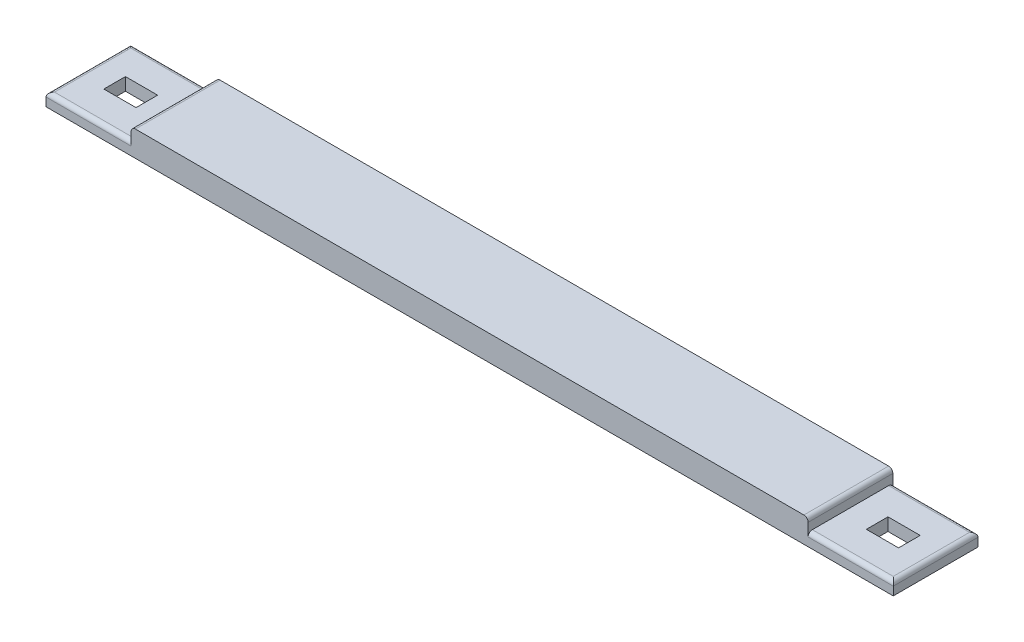
ISO-10303-21;
HEADER;
FILE_DESCRIPTION(('STEP AP214'),'2;1');
FILE_NAME('part.step','',(''),(''),'','','');
FILE_SCHEMA(('AUTOMOTIVE_DESIGN { 1 0 10303 214 1 1 1 1 }'));
ENDSEC;
DATA;
#1=APPLICATION_CONTEXT('core data for automotive mechanical design processes');
#2=APPLICATION_PROTOCOL_DEFINITION('international standard','automotive_design',2000,#1);
#3=PRODUCT_CONTEXT('',#1,'mechanical');
#4=PRODUCT('Part','Part','',(#3));
#5=PRODUCT_RELATED_PRODUCT_CATEGORY('part','',(#4));
#6=PRODUCT_DEFINITION_FORMATION('','',#4);
#7=PRODUCT_DEFINITION_CONTEXT('part definition',#1,'design');
#8=PRODUCT_DEFINITION('design','',#6,#7);
#9=PRODUCT_DEFINITION_SHAPE('','',#8);
#10=(LENGTH_UNIT() NAMED_UNIT(*) SI_UNIT(.MILLI.,.METRE.));
#11=(NAMED_UNIT(*) PLANE_ANGLE_UNIT() SI_UNIT($,.RADIAN.));
#12=(NAMED_UNIT(*) SI_UNIT($,.STERADIAN.) SOLID_ANGLE_UNIT());
#13=UNCERTAINTY_MEASURE_WITH_UNIT(LENGTH_MEASURE(1.E-05),#10,'distance_accuracy_value','');
#14=(GEOMETRIC_REPRESENTATION_CONTEXT(3) GLOBAL_UNCERTAINTY_ASSIGNED_CONTEXT((#13)) GLOBAL_UNIT_ASSIGNED_CONTEXT((#10,
#11,#12)) REPRESENTATION_CONTEXT('',''));
#15=CARTESIAN_POINT('',(0.,0.,0.));
#16=DIRECTION('',(0.,0.,1.));
#17=DIRECTION('',(1.,0.,0.));
#18=AXIS2_PLACEMENT_3D('',#15,#16,#17);
#19=CARTESIAN_POINT('',(-100.,6.,9.99999999999999));
#20=DIRECTION('',(1.,0.,0.));
#21=DIRECTION('',(0.,0.,-1.));
#22=AXIS2_PLACEMENT_3D('',#19,#20,#21);
#23=PLANE('',#22);
#24=DIRECTION('',(0.,-1.,0.));
#25=VECTOR('',#24,1.);
#26=CARTESIAN_POINT('',(-100.,6.,9.99999999999999));
#27=LINE('',#26,#25);
#28=CARTESIAN_POINT('',(-100.,2.,9.99999999999999));
#29=VERTEX_POINT('',#28);
#30=CARTESIAN_POINT('',(-100.,0.,9.99999999999999));
#31=VERTEX_POINT('',#30);
#32=EDGE_CURVE('E287',#29,#31,#27,.T.);
#33=ORIENTED_EDGE('',*,*,#32,.F.);
#34=DIRECTION('',(0.,0.,1.));
#35=VECTOR('',#34,1.);
#36=CARTESIAN_POINT('',(-100.,2.,-10.));
#37=LINE('',#36,#35);
#38=CARTESIAN_POINT('',(-100.,2.,-10.));
#39=VERTEX_POINT('',#38);
#40=EDGE_CURVE('E348',#29,#39,#37,.F.);
#41=ORIENTED_EDGE('',*,*,#40,.T.);
#42=DIRECTION('',(0.,-1.,0.));
#43=VECTOR('',#42,1.);
#44=CARTESIAN_POINT('',(-100.,6.,-10.));
#45=LINE('',#44,#43);
#46=CARTESIAN_POINT('',(-100.,0.,-10.));
#47=VERTEX_POINT('',#46);
#48=EDGE_CURVE('E290',#39,#47,#45,.T.);
#49=ORIENTED_EDGE('',*,*,#48,.T.);
#50=DIRECTION('',(0.,0.,1.));
#51=VECTOR('',#50,1.);
#52=CARTESIAN_POINT('',(-100.,0.,9.99999999999999));
#53=LINE('',#52,#51);
#54=EDGE_CURVE('E278',#47,#31,#53,.T.);
#55=ORIENTED_EDGE('',*,*,#54,.T.);
#56=EDGE_LOOP('',(#33,#41,#49,#55));
#57=FACE_BOUND('',#56,.T.);
#58=ADVANCED_FACE('F38',(#57),#23,.F.);
#59=CARTESIAN_POINT('',(-86.2,6.,2.54999999999998));
#60=DIRECTION('',(-1.,0.,0.));
#61=DIRECTION('',(0.,0.,1.));
#62=AXIS2_PLACEMENT_3D('',#59,#60,#61);
#63=PLANE('',#62);
#64=DIRECTION('',(0.,-1.,0.));
#65=VECTOR('',#64,1.);
#66=CARTESIAN_POINT('',(-86.2,6.,2.54999999999998));
#67=LINE('',#66,#65);
#68=CARTESIAN_POINT('',(-86.2,3.,2.54999999999998));
#69=VERTEX_POINT('',#68);
#70=CARTESIAN_POINT('',(-86.2,0.,2.54999999999998));
#71=VERTEX_POINT('',#70);
#72=EDGE_CURVE('E248',#69,#71,#67,.T.);
#73=ORIENTED_EDGE('',*,*,#72,.F.);
#74=DIRECTION('',(0.,0.,-1.));
#75=VECTOR('',#74,1.);
#76=CARTESIAN_POINT('',(-86.2,3.,2.54999999999998));
#77=LINE('',#76,#75);
#78=CARTESIAN_POINT('',(-86.2,3.,-2.55000000000002));
#79=VERTEX_POINT('',#78);
#80=EDGE_CURVE('E421',#69,#79,#77,.T.);
#81=ORIENTED_EDGE('',*,*,#80,.T.);
#82=DIRECTION('',(0.,-1.,0.));
#83=VECTOR('',#82,1.);
#84=CARTESIAN_POINT('',(-86.2,6.,-2.55000000000002));
#85=LINE('',#84,#83);
#86=CARTESIAN_POINT('',(-86.2,0.,-2.55000000000002));
#87=VERTEX_POINT('',#86);
#88=EDGE_CURVE('E257',#79,#87,#85,.T.);
#89=ORIENTED_EDGE('',*,*,#88,.T.);
#90=DIRECTION('',(0.,0.,-1.));
#91=VECTOR('',#90,1.);
#92=CARTESIAN_POINT('',(-86.2,0.,2.54999999999998));
#93=LINE('',#92,#91);
#94=EDGE_CURVE('E232',#71,#87,#93,.T.);
#95=ORIENTED_EDGE('',*,*,#94,.F.);
#96=EDGE_LOOP('',(#73,#81,#89,#95));
#97=FACE_BOUND('',#96,.T.);
#98=ADVANCED_FACE('F459',(#97),#63,.T.);
#99=CARTESIAN_POINT('',(-93.8,6.,-2.55000000000002));
#100=DIRECTION('',(0.,0.,1.));
#101=DIRECTION('',(1.,0.,0.));
#102=AXIS2_PLACEMENT_3D('',#99,#100,#101);
#103=PLANE('',#102);
#104=ORIENTED_EDGE('',*,*,#88,.F.);
#105=DIRECTION('',(-1.,0.,0.));
#106=VECTOR('',#105,1.);
#107=CARTESIAN_POINT('',(-93.8,3.,-2.55000000000002));
#108=LINE('',#107,#106);
#109=CARTESIAN_POINT('',(-93.8,3.,-2.55000000000002));
#110=VERTEX_POINT('',#109);
#111=EDGE_CURVE('E417',#79,#110,#108,.T.);
#112=ORIENTED_EDGE('',*,*,#111,.T.);
#113=DIRECTION('',(0.,-1.,0.));
#114=VECTOR('',#113,1.);
#115=CARTESIAN_POINT('',(-93.8,6.,-2.55000000000002));
#116=LINE('',#115,#114);
#117=CARTESIAN_POINT('',(-93.8,0.,-2.55000000000002));
#118=VERTEX_POINT('',#117);
#119=EDGE_CURVE('E254',#110,#118,#116,.T.);
#120=ORIENTED_EDGE('',*,*,#119,.T.);
#121=DIRECTION('',(-1.,0.,0.));
#122=VECTOR('',#121,1.);
#123=CARTESIAN_POINT('',(-93.8,0.,-2.55000000000002));
#124=LINE('',#123,#122);
#125=EDGE_CURVE('E236',#87,#118,#124,.T.);
#126=ORIENTED_EDGE('',*,*,#125,.F.);
#127=EDGE_LOOP('',(#104,#112,#120,#126));
#128=FACE_BOUND('',#127,.T.);
#129=ADVANCED_FACE('F467',(#128),#103,.T.);
#130=CARTESIAN_POINT('',(-93.8,6.,2.54999999999998));
#131=DIRECTION('',(1.,0.,0.));
#132=DIRECTION('',(0.,0.,-1.));
#133=AXIS2_PLACEMENT_3D('',#130,#131,#132);
#134=PLANE('',#133);
#135=ORIENTED_EDGE('',*,*,#119,.F.);
#136=DIRECTION('',(0.,0.,1.));
#137=VECTOR('',#136,1.);
#138=CARTESIAN_POINT('',(-93.8,3.,2.54999999999998));
#139=LINE('',#138,#137);
#140=CARTESIAN_POINT('',(-93.8,3.,2.54999999999998));
#141=VERTEX_POINT('',#140);
#142=EDGE_CURVE('E413',#110,#141,#139,.T.);
#143=ORIENTED_EDGE('',*,*,#142,.T.);
#144=DIRECTION('',(0.,-1.,0.));
#145=VECTOR('',#144,1.);
#146=CARTESIAN_POINT('',(-93.8,6.,2.54999999999998));
#147=LINE('',#146,#145);
#148=CARTESIAN_POINT('',(-93.8,0.,2.54999999999998));
#149=VERTEX_POINT('',#148);
#150=EDGE_CURVE('E251',#141,#149,#147,.T.);
#151=ORIENTED_EDGE('',*,*,#150,.T.);
#152=DIRECTION('',(0.,0.,1.));
#153=VECTOR('',#152,1.);
#154=CARTESIAN_POINT('',(-93.8,0.,2.54999999999998));
#155=LINE('',#154,#153);
#156=EDGE_CURVE('E240',#118,#149,#155,.T.);
#157=ORIENTED_EDGE('',*,*,#156,.F.);
#158=EDGE_LOOP('',(#135,#143,#151,#157));
#159=FACE_BOUND('',#158,.T.);
#160=ADVANCED_FACE('F596',(#159),#134,.T.);
#161=CARTESIAN_POINT('',(-93.8,6.,2.54999999999998));
#162=DIRECTION('',(0.,0.,-1.));
#163=DIRECTION('',(-1.,0.,0.));
#164=AXIS2_PLACEMENT_3D('',#161,#162,#163);
#165=PLANE('',#164);
#166=ORIENTED_EDGE('',*,*,#150,.F.);
#167=DIRECTION('',(1.,0.,0.));
#168=VECTOR('',#167,1.);
#169=CARTESIAN_POINT('',(-93.8,3.,2.54999999999998));
#170=LINE('',#169,#168);
#171=EDGE_CURVE('E202',#141,#69,#170,.T.);
#172=ORIENTED_EDGE('',*,*,#171,.T.);
#173=ORIENTED_EDGE('',*,*,#72,.T.);
#174=DIRECTION('',(1.,0.,0.));
#175=VECTOR('',#174,1.);
#176=CARTESIAN_POINT('',(-93.8,0.,2.54999999999998));
#177=LINE('',#176,#175);
#178=EDGE_CURVE('E244',#149,#71,#177,.T.);
#179=ORIENTED_EDGE('',*,*,#178,.F.);
#180=EDGE_LOOP('',(#166,#172,#173,#179));
#181=FACE_BOUND('',#180,.T.);
#182=ADVANCED_FACE('F590',(#181),#165,.T.);
#183=CARTESIAN_POINT('',(0.,6.,0.));
#184=DIRECTION('',(0.,-1.,0.));
#185=DIRECTION('',(0.,0.,-1.));
#186=AXIS2_PLACEMENT_3D('',#183,#184,#185);
#187=PLANE('',#186);
#188=DIRECTION('',(1.,0.,0.));
#189=VECTOR('',#188,1.);
#190=CARTESIAN_POINT('',(-100.,6.,9.99999999999999));
#191=LINE('',#190,#189);
#192=CARTESIAN_POINT('',(-78.9000000000001,6.,9.99999999999999));
#193=VERTEX_POINT('',#192);
#194=CARTESIAN_POINT('',(78.8999999999999,6.,9.99999999999999));
#195=VERTEX_POINT('',#194);
#196=EDGE_CURVE('E265',#193,#195,#191,.T.);
#197=ORIENTED_EDGE('',*,*,#196,.T.);
#198=DIRECTION('',(0.,0.,1.));
#199=VECTOR('',#198,1.);
#200=CARTESIAN_POINT('',(78.8999999999999,6.,0.));
#201=LINE('',#200,#199);
#202=CARTESIAN_POINT('',(78.8999999999999,6.,-10.));
#203=VERTEX_POINT('',#202);
#204=EDGE_CURVE('E318',#195,#203,#201,.F.);
#205=ORIENTED_EDGE('',*,*,#204,.T.);
#206=DIRECTION('',(-1.,0.,0.));
#207=VECTOR('',#206,1.);
#208=CARTESIAN_POINT('',(-100.,6.,-10.));
#209=LINE('',#208,#207);
#210=CARTESIAN_POINT('',(-78.9000000000001,6.,-10.));
#211=VERTEX_POINT('',#210);
#212=EDGE_CURVE('E261',#203,#211,#209,.T.);
#213=ORIENTED_EDGE('',*,*,#212,.T.);
#214=DIRECTION('',(0.,0.,-1.));
#215=VECTOR('',#214,1.);
#216=CARTESIAN_POINT('',(-78.9000000000001,6.,0.));
#217=LINE('',#216,#215);
#218=EDGE_CURVE('E315',#211,#193,#217,.F.);
#219=ORIENTED_EDGE('',*,*,#218,.T.);
#220=EDGE_LOOP('',(#197,#205,#213,#219));
#221=FACE_BOUND('',#220,.T.);
#222=ADVANCED_FACE('F595',(#221),#187,.F.);
#223=CARTESIAN_POINT('',(0.,0.,0.));
#224=DIRECTION('',(0.,-1.,0.));
#225=DIRECTION('',(0.,0.,-1.));
#226=AXIS2_PLACEMENT_3D('',#223,#224,#225);
#227=PLANE('',#226);
#228=DIRECTION('',(0.,0.,-1.));
#229=VECTOR('',#228,1.);
#230=CARTESIAN_POINT('',(99.9999999999999,0.,9.99999999999999));
#231=LINE('',#230,#229);
#232=CARTESIAN_POINT('',(99.9999999999999,0.,9.99999999999999));
#233=VERTEX_POINT('',#232);
#234=CARTESIAN_POINT('',(99.9999999999999,0.,-10.));
#235=VERTEX_POINT('',#234);
#236=EDGE_CURVE('E260',#233,#235,#231,.T.);
#237=ORIENTED_EDGE('',*,*,#236,.F.);
#238=DIRECTION('',(1.,0.,0.));
#239=VECTOR('',#238,1.);
#240=CARTESIAN_POINT('',(-100.,0.,9.99999999999999));
#241=LINE('',#240,#239);
#242=EDGE_CURVE('E266',#31,#233,#241,.T.);
#243=ORIENTED_EDGE('',*,*,#242,.F.);
#244=ORIENTED_EDGE('',*,*,#54,.F.);
#245=DIRECTION('',(-1.,0.,0.));
#246=VECTOR('',#245,1.);
#247=CARTESIAN_POINT('',(-100.,0.,-10.));
#248=LINE('',#247,#246);
#249=EDGE_CURVE('E274',#235,#47,#248,.T.);
#250=ORIENTED_EDGE('',*,*,#249,.F.);
#251=EDGE_LOOP('',(#237,#243,#244,#250));
#252=FACE_BOUND('',#251,.T.);
#253=ORIENTED_EDGE('',*,*,#178,.T.);
#254=ORIENTED_EDGE('',*,*,#94,.T.);
#255=ORIENTED_EDGE('',*,*,#125,.T.);
#256=ORIENTED_EDGE('',*,*,#156,.T.);
#257=EDGE_LOOP('',(#253,#254,#255,#256));
#258=FACE_BOUND('',#257,.T.);
#259=DIRECTION('',(1.,0.,0.));
#260=VECTOR('',#259,1.);
#261=CARTESIAN_POINT('',(93.8,0.,2.54999999999998));
#262=LINE('',#261,#260);
#263=CARTESIAN_POINT('',(86.2,0.,2.54999999999998));
#264=VERTEX_POINT('',#263);
#265=CARTESIAN_POINT('',(93.8,0.,2.54999999999998));
#266=VERTEX_POINT('',#265);
#267=EDGE_CURVE('E218',#264,#266,#262,.T.);
#268=ORIENTED_EDGE('',*,*,#267,.T.);
#269=DIRECTION('',(0.,0.,-1.));
#270=VECTOR('',#269,1.);
#271=CARTESIAN_POINT('',(93.8,0.,2.54999999999998));
#272=LINE('',#271,#270);
#273=CARTESIAN_POINT('',(93.8,0.,-2.55000000000002));
#274=VERTEX_POINT('',#273);
#275=EDGE_CURVE('E425',#266,#274,#272,.T.);
#276=ORIENTED_EDGE('',*,*,#275,.T.);
#277=DIRECTION('',(-1.,0.,0.));
#278=VECTOR('',#277,1.);
#279=CARTESIAN_POINT('',(93.8,0.,-2.55000000000002));
#280=LINE('',#279,#278);
#281=CARTESIAN_POINT('',(86.2,0.,-2.55000000000002));
#282=VERTEX_POINT('',#281);
#283=EDGE_CURVE('E429',#274,#282,#280,.T.);
#284=ORIENTED_EDGE('',*,*,#283,.T.);
#285=DIRECTION('',(0.,0.,1.));
#286=VECTOR('',#285,1.);
#287=CARTESIAN_POINT('',(86.2,0.,2.54999999999998));
#288=LINE('',#287,#286);
#289=EDGE_CURVE('E433',#282,#264,#288,.T.);
#290=ORIENTED_EDGE('',*,*,#289,.T.);
#291=EDGE_LOOP('',(#268,#276,#284,#290));
#292=FACE_BOUND('',#291,.T.);
#293=ADVANCED_FACE('F437',(#252,#258,#292),#227,.T.);
#294=CARTESIAN_POINT('',(99.9999999999999,6.,9.99999999999999));
#295=DIRECTION('',(-1.,0.,0.));
#296=DIRECTION('',(0.,0.,1.));
#297=AXIS2_PLACEMENT_3D('',#294,#295,#296);
#298=PLANE('',#297);
#299=DIRECTION('',(0.,-1.,0.));
#300=VECTOR('',#299,1.);
#301=CARTESIAN_POINT('',(99.9999999999999,6.,-10.));
#302=LINE('',#301,#300);
#303=CARTESIAN_POINT('',(99.9999999999999,2.,-10.));
#304=VERTEX_POINT('',#303);
#305=EDGE_CURVE('E203',#304,#235,#302,.T.);
#306=ORIENTED_EDGE('',*,*,#305,.F.);
#307=DIRECTION('',(0.,0.,-1.));
#308=VECTOR('',#307,1.);
#309=CARTESIAN_POINT('',(99.9999999999999,2.,9.99999999999999));
#310=LINE('',#309,#308);
#311=CARTESIAN_POINT('',(99.9999999999999,2.,9.99999999999999));
#312=VERTEX_POINT('',#311);
#313=EDGE_CURVE('E359',#304,#312,#310,.F.);
#314=ORIENTED_EDGE('',*,*,#313,.T.);
#315=DIRECTION('',(0.,-1.,0.));
#316=VECTOR('',#315,1.);
#317=CARTESIAN_POINT('',(99.9999999999999,6.,9.99999999999999));
#318=LINE('',#317,#316);
#319=EDGE_CURVE('E270',#312,#233,#318,.T.);
#320=ORIENTED_EDGE('',*,*,#319,.T.);
#321=ORIENTED_EDGE('',*,*,#236,.T.);
#322=EDGE_LOOP('',(#306,#314,#320,#321));
#323=FACE_BOUND('',#322,.T.);
#324=ADVANCED_FACE('F475',(#323),#298,.F.);
#325=CARTESIAN_POINT('',(-100.,6.,-10.));
#326=DIRECTION('',(0.,0.,1.));
#327=DIRECTION('',(1.,0.,0.));
#328=AXIS2_PLACEMENT_3D('',#325,#326,#327);
#329=PLANE('',#328);
#330=ORIENTED_EDGE('',*,*,#212,.F.);
#331=CARTESIAN_POINT('',(78.8999999999999,5.,-10.));
#332=DIRECTION('',(0.,0.,1.));
#333=DIRECTION('',(1.,0.,0.));
#334=AXIS2_PLACEMENT_3D('',#331,#332,#333);
#335=CIRCLE('',#334,1.);
#336=CARTESIAN_POINT('',(79.8999999999999,5.,-10.));
#337=VERTEX_POINT('',#336);
#338=EDGE_CURVE('E331',#203,#337,#335,.F.);
#339=ORIENTED_EDGE('',*,*,#338,.T.);
#340=DIRECTION('',(0.,1.,0.));
#341=VECTOR('',#340,1.);
#342=CARTESIAN_POINT('',(79.8999999999999,3.,-10.));
#343=LINE('',#342,#341);
#344=CARTESIAN_POINT('',(79.8999999999999,2.,-10.));
#345=VERTEX_POINT('',#344);
#346=EDGE_CURVE('E396',#345,#337,#343,.T.);
#347=ORIENTED_EDGE('',*,*,#346,.F.);
#348=DIRECTION('',(-1.,0.,0.));
#349=VECTOR('',#348,1.);
#350=CARTESIAN_POINT('',(-100.,2.,-10.));
#351=LINE('',#350,#349);
#352=EDGE_CURVE('E321',#345,#304,#351,.F.);
#353=ORIENTED_EDGE('',*,*,#352,.T.);
#354=ORIENTED_EDGE('',*,*,#305,.T.);
#355=ORIENTED_EDGE('',*,*,#249,.T.);
#356=ORIENTED_EDGE('',*,*,#48,.F.);
#357=DIRECTION('',(-1.,0.,0.));
#358=VECTOR('',#357,1.);
#359=CARTESIAN_POINT('',(-79.9000000000001,2.,-10.));
#360=LINE('',#359,#358);
#361=CARTESIAN_POINT('',(-79.9000000000001,2.,-10.));
#362=VERTEX_POINT('',#361);
#363=EDGE_CURVE('E324',#39,#362,#360,.F.);
#364=ORIENTED_EDGE('',*,*,#363,.T.);
#365=DIRECTION('',(0.,1.,0.));
#366=VECTOR('',#365,1.);
#367=CARTESIAN_POINT('',(-79.9000000000001,3.,-10.));
#368=LINE('',#367,#366);
#369=CARTESIAN_POINT('',(-79.9000000000001,5.,-10.));
#370=VERTEX_POINT('',#369);
#371=EDGE_CURVE('E214',#362,#370,#368,.T.);
#372=ORIENTED_EDGE('',*,*,#371,.T.);
#373=CARTESIAN_POINT('',(-78.9000000000001,5.,-10.));
#374=DIRECTION('',(0.,0.,1.));
#375=DIRECTION('',(1.,0.,0.));
#376=AXIS2_PLACEMENT_3D('',#373,#374,#375);
#377=CIRCLE('',#376,1.);
#378=EDGE_CURVE('E328',#370,#211,#377,.F.);
#379=ORIENTED_EDGE('',*,*,#378,.T.);
#380=EDGE_LOOP('',(#330,#339,#347,#353,#354,#355,#356,#364,#372,#379));
#381=FACE_BOUND('',#380,.T.);
#382=ADVANCED_FACE('F454',(#381),#329,.F.);
#383=CARTESIAN_POINT('',(-100.,6.,9.99999999999999));
#384=DIRECTION('',(0.,0.,-1.));
#385=DIRECTION('',(-1.,0.,0.));
#386=AXIS2_PLACEMENT_3D('',#383,#384,#385);
#387=PLANE('',#386);
#388=DIRECTION('',(0.,1.,0.));
#389=VECTOR('',#388,1.);
#390=CARTESIAN_POINT('',(79.8999999999999,3.,9.99999999999999));
#391=LINE('',#390,#389);
#392=CARTESIAN_POINT('',(79.8999999999999,2.,9.99999999999999));
#393=VERTEX_POINT('',#392);
#394=CARTESIAN_POINT('',(79.8999999999999,5.,9.99999999999999));
#395=VERTEX_POINT('',#394);
#396=EDGE_CURVE('E399',#393,#395,#391,.T.);
#397=ORIENTED_EDGE('',*,*,#396,.T.);
#398=CARTESIAN_POINT('',(78.8999999999999,5.,10.));
#399=DIRECTION('',(0.,0.,-1.));
#400=DIRECTION('',(-1.,0.,0.));
#401=AXIS2_PLACEMENT_3D('',#398,#399,#400);
#402=CIRCLE('',#401,1.);
#403=EDGE_CURVE('E312',#395,#195,#402,.F.);
#404=ORIENTED_EDGE('',*,*,#403,.T.);
#405=ORIENTED_EDGE('',*,*,#196,.F.);
#406=CARTESIAN_POINT('',(-78.9000000000001,5.,9.99999999999999));
#407=DIRECTION('',(0.,0.,-1.));
#408=DIRECTION('',(-1.,0.,0.));
#409=AXIS2_PLACEMENT_3D('',#406,#407,#408);
#410=CIRCLE('',#409,1.);
#411=CARTESIAN_POINT('',(-79.9000000000001,5.,9.99999999999999));
#412=VERTEX_POINT('',#411);
#413=EDGE_CURVE('E309',#193,#412,#410,.F.);
#414=ORIENTED_EDGE('',*,*,#413,.T.);
#415=DIRECTION('',(0.,1.,0.));
#416=VECTOR('',#415,1.);
#417=CARTESIAN_POINT('',(-79.9000000000001,3.,9.99999999999999));
#418=LINE('',#417,#416);
#419=CARTESIAN_POINT('',(-79.9000000000001,2.,9.99999999999999));
#420=VERTEX_POINT('',#419);
#421=EDGE_CURVE('E403',#420,#412,#418,.T.);
#422=ORIENTED_EDGE('',*,*,#421,.F.);
#423=DIRECTION('',(1.,0.,0.));
#424=VECTOR('',#423,1.);
#425=CARTESIAN_POINT('',(-100.,2.,9.99999999999999));
#426=LINE('',#425,#424);
#427=EDGE_CURVE('E306',#420,#29,#426,.F.);
#428=ORIENTED_EDGE('',*,*,#427,.T.);
#429=ORIENTED_EDGE('',*,*,#32,.T.);
#430=ORIENTED_EDGE('',*,*,#242,.T.);
#431=ORIENTED_EDGE('',*,*,#319,.F.);
#432=DIRECTION('',(1.,0.,0.));
#433=VECTOR('',#432,1.);
#434=CARTESIAN_POINT('',(-100.,2.,9.99999999999999));
#435=LINE('',#434,#433);
#436=EDGE_CURVE('E302',#312,#393,#435,.F.);
#437=ORIENTED_EDGE('',*,*,#436,.T.);
#438=EDGE_LOOP('',(#397,#404,#405,#414,#422,#428,#429,#430,#431,#437));
#439=FACE_BOUND('',#438,.T.);
#440=ADVANCED_FACE('F446',(#439),#387,.F.);
#441=CARTESIAN_POINT('',(93.8,6.,2.54999999999998));
#442=DIRECTION('',(-1.,0.,0.));
#443=DIRECTION('',(0.,0.,1.));
#444=AXIS2_PLACEMENT_3D('',#441,#442,#443);
#445=PLANE('',#444);
#446=DIRECTION('',(0.,0.,1.));
#447=VECTOR('',#446,1.);
#448=CARTESIAN_POINT('',(93.8,3.,2.54999999999998));
#449=LINE('',#448,#447);
#450=CARTESIAN_POINT('',(93.8,3.,-2.55000000000002));
#451=VERTEX_POINT('',#450);
#452=CARTESIAN_POINT('',(93.8,3.,2.54999999999998));
#453=VERTEX_POINT('',#452);
#454=EDGE_CURVE('E197',#451,#453,#449,.T.);
#455=ORIENTED_EDGE('',*,*,#454,.F.);
#456=DIRECTION('',(0.,-1.,0.));
#457=VECTOR('',#456,1.);
#458=CARTESIAN_POINT('',(93.8,6.,-2.55000000000002));
#459=LINE('',#458,#457);
#460=EDGE_CURVE('E225',#451,#274,#459,.T.);
#461=ORIENTED_EDGE('',*,*,#460,.T.);
#462=ORIENTED_EDGE('',*,*,#275,.F.);
#463=DIRECTION('',(0.,-1.,0.));
#464=VECTOR('',#463,1.);
#465=CARTESIAN_POINT('',(93.8,6.,2.54999999999998));
#466=LINE('',#465,#464);
#467=EDGE_CURVE('E221',#453,#266,#466,.T.);
#468=ORIENTED_EDGE('',*,*,#467,.F.);
#469=EDGE_LOOP('',(#455,#461,#462,#468));
#470=FACE_BOUND('',#469,.T.);
#471=ADVANCED_FACE('F444',(#470),#445,.T.);
#472=CARTESIAN_POINT('',(93.8,6.,-2.55000000000002));
#473=DIRECTION('',(0.,0.,1.));
#474=DIRECTION('',(1.,0.,0.));
#475=AXIS2_PLACEMENT_3D('',#472,#473,#474);
#476=PLANE('',#475);
#477=DIRECTION('',(1.,0.,0.));
#478=VECTOR('',#477,1.);
#479=CARTESIAN_POINT('',(93.8,3.,-2.55000000000002));
#480=LINE('',#479,#478);
#481=CARTESIAN_POINT('',(86.2,3.,-2.55000000000002));
#482=VERTEX_POINT('',#481);
#483=EDGE_CURVE('E213',#482,#451,#480,.T.);
#484=ORIENTED_EDGE('',*,*,#483,.F.);
#485=DIRECTION('',(0.,-1.,0.));
#486=VECTOR('',#485,1.);
#487=CARTESIAN_POINT('',(86.2,6.,-2.55000000000002));
#488=LINE('',#487,#486);
#489=EDGE_CURVE('E211',#482,#282,#488,.T.);
#490=ORIENTED_EDGE('',*,*,#489,.T.);
#491=ORIENTED_EDGE('',*,*,#283,.F.);
#492=ORIENTED_EDGE('',*,*,#460,.F.);
#493=EDGE_LOOP('',(#484,#490,#491,#492));
#494=FACE_BOUND('',#493,.T.);
#495=ADVANCED_FACE('F442',(#494),#476,.T.);
#496=CARTESIAN_POINT('',(86.2,6.,2.54999999999998));
#497=DIRECTION('',(1.,0.,0.));
#498=DIRECTION('',(0.,0.,-1.));
#499=AXIS2_PLACEMENT_3D('',#496,#497,#498);
#500=PLANE('',#499);
#501=DIRECTION('',(0.,0.,-1.));
#502=VECTOR('',#501,1.);
#503=CARTESIAN_POINT('',(86.2,3.,2.54999999999998));
#504=LINE('',#503,#502);
#505=CARTESIAN_POINT('',(86.2,3.,2.54999999999998));
#506=VERTEX_POINT('',#505);
#507=EDGE_CURVE('E194',#506,#482,#504,.T.);
#508=ORIENTED_EDGE('',*,*,#507,.F.);
#509=DIRECTION('',(0.,-1.,0.));
#510=VECTOR('',#509,1.);
#511=CARTESIAN_POINT('',(86.2,6.,2.54999999999998));
#512=LINE('',#511,#510);
#513=EDGE_CURVE('E209',#506,#264,#512,.T.);
#514=ORIENTED_EDGE('',*,*,#513,.T.);
#515=ORIENTED_EDGE('',*,*,#289,.F.);
#516=ORIENTED_EDGE('',*,*,#489,.F.);
#517=EDGE_LOOP('',(#508,#514,#515,#516));
#518=FACE_BOUND('',#517,.T.);
#519=ADVANCED_FACE('F207',(#518),#500,.T.);
#520=CARTESIAN_POINT('',(93.8,6.,2.54999999999998));
#521=DIRECTION('',(0.,0.,-1.));
#522=DIRECTION('',(-1.,0.,0.));
#523=AXIS2_PLACEMENT_3D('',#520,#521,#522);
#524=PLANE('',#523);
#525=DIRECTION('',(-1.,0.,0.));
#526=VECTOR('',#525,1.);
#527=CARTESIAN_POINT('',(93.8,3.,2.54999999999998));
#528=LINE('',#527,#526);
#529=EDGE_CURVE('E191',#453,#506,#528,.T.);
#530=ORIENTED_EDGE('',*,*,#529,.F.);
#531=ORIENTED_EDGE('',*,*,#467,.T.);
#532=ORIENTED_EDGE('',*,*,#267,.F.);
#533=ORIENTED_EDGE('',*,*,#513,.F.);
#534=EDGE_LOOP('',(#530,#531,#532,#533));
#535=FACE_BOUND('',#534,.T.);
#536=ADVANCED_FACE('F216',(#535),#524,.T.);
#537=CARTESIAN_POINT('',(79.8999999999999,3.,-10.));
#538=DIRECTION('',(-1.,0.,0.));
#539=DIRECTION('',(0.,0.,1.));
#540=AXIS2_PLACEMENT_3D('',#537,#538,#539);
#541=PLANE('',#540);
#542=ORIENTED_EDGE('',*,*,#346,.T.);
#543=DIRECTION('',(0.,0.,1.));
#544=VECTOR('',#543,1.);
#545=CARTESIAN_POINT('',(79.8999999999999,5.,-10.));
#546=LINE('',#545,#544);
#547=EDGE_CURVE('E298',#337,#395,#546,.T.);
#548=ORIENTED_EDGE('',*,*,#547,.T.);
#549=ORIENTED_EDGE('',*,*,#396,.F.);
#550=CARTESIAN_POINT('',(79.8999999999999,2.,8.99999999999999));
#551=DIRECTION('',(-1.,0.,0.));
#552=DIRECTION('',(0.,0.,1.));
#553=AXIS2_PLACEMENT_3D('',#550,#551,#552);
#554=CIRCLE('',#553,1.);
#555=CARTESIAN_POINT('',(79.8999999999999,3.,9.));
#556=VERTEX_POINT('',#555);
#557=EDGE_CURVE('E48',#393,#556,#554,.T.);
#558=ORIENTED_EDGE('',*,*,#557,.T.);
#559=DIRECTION('',(0.,0.,1.));
#560=VECTOR('',#559,1.);
#561=CARTESIAN_POINT('',(79.8999999999999,3.,-10.));
#562=LINE('',#561,#560);
#563=CARTESIAN_POINT('',(79.8999999999999,3.,-9.00000000000001));
#564=VERTEX_POINT('',#563);
#565=EDGE_CURVE('E378',#564,#556,#562,.T.);
#566=ORIENTED_EDGE('',*,*,#565,.F.);
#567=CARTESIAN_POINT('',(79.8999999999999,2.,-9.00000000000001));
#568=DIRECTION('',(-1.,0.,0.));
#569=DIRECTION('',(0.,0.,1.));
#570=AXIS2_PLACEMENT_3D('',#567,#568,#569);
#571=CIRCLE('',#570,1.);
#572=EDGE_CURVE('E11',#564,#345,#571,.T.);
#573=ORIENTED_EDGE('',*,*,#572,.T.);
#574=EDGE_LOOP('',(#542,#548,#549,#558,#566,#573));
#575=FACE_BOUND('',#574,.T.);
#576=ADVANCED_FACE('F393',(#575),#541,.F.);
#577=CARTESIAN_POINT('',(0.,3.,0.));
#578=DIRECTION('',(0.,-1.,0.));
#579=DIRECTION('',(0.,0.,-1.));
#580=AXIS2_PLACEMENT_3D('',#577,#578,#579);
#581=PLANE('',#580);
#582=ORIENTED_EDGE('',*,*,#454,.T.);
#583=ORIENTED_EDGE('',*,*,#529,.T.);
#584=ORIENTED_EDGE('',*,*,#507,.T.);
#585=ORIENTED_EDGE('',*,*,#483,.T.);
#586=EDGE_LOOP('',(#582,#583,#584,#585));
#587=FACE_BOUND('',#586,.T.);
#588=ORIENTED_EDGE('',*,*,#565,.T.);
#589=DIRECTION('',(1.,0.,0.));
#590=VECTOR('',#589,1.);
#591=CARTESIAN_POINT('',(0.,3.,8.99999999999999));
#592=LINE('',#591,#590);
#593=CARTESIAN_POINT('',(98.9999999999999,3.,8.99999999999999));
#594=VERTEX_POINT('',#593);
#595=EDGE_CURVE('E356',#556,#594,#592,.T.);
#596=ORIENTED_EDGE('',*,*,#595,.T.);
#597=DIRECTION('',(0.,0.,-1.));
#598=VECTOR('',#597,1.);
#599=CARTESIAN_POINT('',(98.9999999999999,3.,0.));
#600=LINE('',#599,#598);
#601=CARTESIAN_POINT('',(98.9999999999999,3.,-9.00000000000001));
#602=VERTEX_POINT('',#601);
#603=EDGE_CURVE('E63',#594,#602,#600,.T.);
#604=ORIENTED_EDGE('',*,*,#603,.T.);
#605=DIRECTION('',(-1.,0.,0.));
#606=VECTOR('',#605,1.);
#607=CARTESIAN_POINT('',(0.,3.,-9.00000000000001));
#608=LINE('',#607,#606);
#609=EDGE_CURVE('E351',#602,#564,#608,.T.);
#610=ORIENTED_EDGE('',*,*,#609,.T.);
#611=EDGE_LOOP('',(#588,#596,#604,#610));
#612=FACE_BOUND('',#611,.T.);
#613=ADVANCED_FACE('F193',(#587,#612),#581,.F.);
#614=CARTESIAN_POINT('',(-79.9000000000001,3.,-10.));
#615=DIRECTION('',(1.,0.,0.));
#616=DIRECTION('',(0.,0.,-1.));
#617=AXIS2_PLACEMENT_3D('',#614,#615,#616);
#618=PLANE('',#617);
#619=ORIENTED_EDGE('',*,*,#421,.T.);
#620=DIRECTION('',(0.,0.,-1.));
#621=VECTOR('',#620,1.);
#622=CARTESIAN_POINT('',(-79.9000000000001,5.,-10.));
#623=LINE('',#622,#621);
#624=EDGE_CURVE('E334',#412,#370,#623,.T.);
#625=ORIENTED_EDGE('',*,*,#624,.T.);
#626=ORIENTED_EDGE('',*,*,#371,.F.);
#627=CARTESIAN_POINT('',(-79.9000000000001,2.,-9.00000000000001));
#628=DIRECTION('',(1.,0.,0.));
#629=DIRECTION('',(0.,0.,-1.));
#630=AXIS2_PLACEMENT_3D('',#627,#628,#629);
#631=CIRCLE('',#630,1.);
#632=CARTESIAN_POINT('',(-79.9000000000001,3.,-9.00000000000001));
#633=VERTEX_POINT('',#632);
#634=EDGE_CURVE('E366',#362,#633,#631,.T.);
#635=ORIENTED_EDGE('',*,*,#634,.T.);
#636=DIRECTION('',(0.,0.,-1.));
#637=VECTOR('',#636,1.);
#638=CARTESIAN_POINT('',(-79.9000000000001,3.,-10.));
#639=LINE('',#638,#637);
#640=CARTESIAN_POINT('',(-79.9000000000001,3.,8.99999999999999));
#641=VERTEX_POINT('',#640);
#642=EDGE_CURVE('E407',#641,#633,#639,.T.);
#643=ORIENTED_EDGE('',*,*,#642,.F.);
#644=CARTESIAN_POINT('',(-79.9000000000001,2.,8.99999999999999));
#645=DIRECTION('',(1.,0.,0.));
#646=DIRECTION('',(0.,0.,-1.));
#647=AXIS2_PLACEMENT_3D('',#644,#645,#646);
#648=CIRCLE('',#647,1.);
#649=EDGE_CURVE('E362',#641,#420,#648,.T.);
#650=ORIENTED_EDGE('',*,*,#649,.T.);
#651=EDGE_LOOP('',(#619,#625,#626,#635,#643,#650));
#652=FACE_BOUND('',#651,.T.);
#653=ADVANCED_FACE('F536',(#652),#618,.F.);
#654=CARTESIAN_POINT('',(0.,3.,0.));
#655=DIRECTION('',(0.,1.,0.));
#656=DIRECTION('',(0.,0.,1.));
#657=AXIS2_PLACEMENT_3D('',#654,#655,#656);
#658=PLANE('',#657);
#659=ORIENTED_EDGE('',*,*,#171,.F.);
#660=ORIENTED_EDGE('',*,*,#142,.F.);
#661=ORIENTED_EDGE('',*,*,#111,.F.);
#662=ORIENTED_EDGE('',*,*,#80,.F.);
#663=EDGE_LOOP('',(#659,#660,#661,#662));
#664=FACE_BOUND('',#663,.T.);
#665=DIRECTION('',(0.,0.,1.));
#666=VECTOR('',#665,1.);
#667=CARTESIAN_POINT('',(-99.0000000000001,3.,9.99999999999999));
#668=LINE('',#667,#666);
#669=CARTESIAN_POINT('',(-99.0000000000001,3.,-9.00000000000001));
#670=VERTEX_POINT('',#669);
#671=CARTESIAN_POINT('',(-99.0000000000001,3.,8.99999999999999));
#672=VERTEX_POINT('',#671);
#673=EDGE_CURVE('E341',#670,#672,#668,.T.);
#674=ORIENTED_EDGE('',*,*,#673,.T.);
#675=DIRECTION('',(1.,0.,0.));
#676=VECTOR('',#675,1.);
#677=CARTESIAN_POINT('',(-79.9000000000001,3.,8.99999999999999));
#678=LINE('',#677,#676);
#679=EDGE_CURVE('E344',#672,#641,#678,.T.);
#680=ORIENTED_EDGE('',*,*,#679,.T.);
#681=ORIENTED_EDGE('',*,*,#642,.T.);
#682=DIRECTION('',(-1.,0.,0.));
#683=VECTOR('',#682,1.);
#684=CARTESIAN_POINT('',(-100.,3.,-9.00000000000001));
#685=LINE('',#684,#683);
#686=EDGE_CURVE('E338',#633,#670,#685,.T.);
#687=ORIENTED_EDGE('',*,*,#686,.T.);
#688=EDGE_LOOP('',(#674,#680,#681,#687));
#689=FACE_BOUND('',#688,.T.);
#690=ADVANCED_FACE('F484',(#664,#689),#658,.T.);
#691=CARTESIAN_POINT('',(78.8999999999999,5.,-10.));
#692=DIRECTION('',(0.,0.,1.));
#693=DIRECTION('',(1.,0.,0.));
#694=AXIS2_PLACEMENT_3D('',#691,#692,#693);
#695=CYLINDRICAL_SURFACE('',#694,1.);
#696=ORIENTED_EDGE('',*,*,#338,.F.);
#697=ORIENTED_EDGE('',*,*,#204,.F.);
#698=ORIENTED_EDGE('',*,*,#403,.F.);
#699=ORIENTED_EDGE('',*,*,#547,.F.);
#700=EDGE_LOOP('',(#696,#697,#698,#699));
#701=FACE_BOUND('',#700,.T.);
#702=ADVANCED_FACE('F480',(#701),#695,.T.);
#703=CARTESIAN_POINT('',(-78.9000000000001,5.,-10.));
#704=DIRECTION('',(0.,0.,-1.));
#705=DIRECTION('',(-1.,0.,0.));
#706=AXIS2_PLACEMENT_3D('',#703,#704,#705);
#707=CYLINDRICAL_SURFACE('',#706,1.);
#708=ORIENTED_EDGE('',*,*,#413,.F.);
#709=ORIENTED_EDGE('',*,*,#218,.F.);
#710=ORIENTED_EDGE('',*,*,#378,.F.);
#711=ORIENTED_EDGE('',*,*,#624,.F.);
#712=EDGE_LOOP('',(#708,#709,#710,#711));
#713=FACE_BOUND('',#712,.T.);
#714=ADVANCED_FACE('F483',(#713),#707,.T.);
#715=CARTESIAN_POINT('',(0.,2.,-9.00000000000001));
#716=DIRECTION('',(1.,0.,0.));
#717=DIRECTION('',(0.,0.,-1.));
#718=AXIS2_PLACEMENT_3D('',#715,#716,#717);
#719=CYLINDRICAL_SURFACE('',#718,1.);
#720=ORIENTED_EDGE('',*,*,#634,.F.);
#721=ORIENTED_EDGE('',*,*,#363,.F.);
#722=CARTESIAN_POINT('',(-99.0000000000001,2.,-9.00000000000001));
#723=DIRECTION('',(0.707106781186547,0.,-0.707106781186547));
#724=DIRECTION('',(0.707106781186547,0.,0.707106781186547));
#725=AXIS2_PLACEMENT_3D('',#722,#723,#724);
#726=ELLIPSE('',#725,1.41421356237309,1.);
#727=EDGE_CURVE('E375',#670,#39,#726,.F.);
#728=ORIENTED_EDGE('',*,*,#727,.F.);
#729=ORIENTED_EDGE('',*,*,#686,.F.);
#730=EDGE_LOOP('',(#720,#721,#728,#729));
#731=FACE_BOUND('',#730,.T.);
#732=ADVANCED_FACE('F488',(#731),#719,.T.);
#733=CARTESIAN_POINT('',(-99.0000000000001,2.,0.));
#734=DIRECTION('',(0.,0.,-1.));
#735=DIRECTION('',(-1.,0.,0.));
#736=AXIS2_PLACEMENT_3D('',#733,#734,#735);
#737=CYLINDRICAL_SURFACE('',#736,1.);
#738=ORIENTED_EDGE('',*,*,#727,.T.);
#739=ORIENTED_EDGE('',*,*,#40,.F.);
#740=CARTESIAN_POINT('',(-99.0000000000001,2.,8.99999999999999));
#741=DIRECTION('',(-0.707106781186547,0.,-0.707106781186547));
#742=DIRECTION('',(0.707106781186547,0.,-0.707106781186547));
#743=AXIS2_PLACEMENT_3D('',#740,#741,#742);
#744=ELLIPSE('',#743,1.41421356237309,1.);
#745=EDGE_CURVE('E371',#672,#29,#744,.F.);
#746=ORIENTED_EDGE('',*,*,#745,.F.);
#747=ORIENTED_EDGE('',*,*,#673,.F.);
#748=EDGE_LOOP('',(#738,#739,#746,#747));
#749=FACE_BOUND('',#748,.T.);
#750=ADVANCED_FACE('F493',(#749),#737,.T.);
#751=CARTESIAN_POINT('',(0.,2.,8.99999999999999));
#752=DIRECTION('',(-1.,0.,0.));
#753=DIRECTION('',(0.,0.,1.));
#754=AXIS2_PLACEMENT_3D('',#751,#752,#753);
#755=CYLINDRICAL_SURFACE('',#754,1.);
#756=ORIENTED_EDGE('',*,*,#745,.T.);
#757=ORIENTED_EDGE('',*,*,#427,.F.);
#758=ORIENTED_EDGE('',*,*,#649,.F.);
#759=ORIENTED_EDGE('',*,*,#679,.F.);
#760=EDGE_LOOP('',(#756,#757,#758,#759));
#761=FACE_BOUND('',#760,.T.);
#762=ADVANCED_FACE('F490',(#761),#755,.T.);
#763=CARTESIAN_POINT('',(0.,2.,-9.00000000000001));
#764=DIRECTION('',(-1.,0.,0.));
#765=DIRECTION('',(0.,0.,1.));
#766=AXIS2_PLACEMENT_3D('',#763,#764,#765);
#767=CYLINDRICAL_SURFACE('',#766,1.);
#768=ORIENTED_EDGE('',*,*,#572,.F.);
#769=ORIENTED_EDGE('',*,*,#609,.F.);
#770=CARTESIAN_POINT('',(98.9999999999999,2.,-9.00000000000001));
#771=DIRECTION('',(-0.707106781186547,0.,-0.707106781186547));
#772=DIRECTION('',(-0.707106781186547,0.,0.707106781186547));
#773=AXIS2_PLACEMENT_3D('',#770,#771,#772);
#774=ELLIPSE('',#773,1.41421356237309,1.);
#775=EDGE_CURVE('E42',#304,#602,#774,.F.);
#776=ORIENTED_EDGE('',*,*,#775,.F.);
#777=ORIENTED_EDGE('',*,*,#352,.F.);
#778=EDGE_LOOP('',(#768,#769,#776,#777));
#779=FACE_BOUND('',#778,.T.);
#780=ADVANCED_FACE('F40',(#779),#767,.T.);
#781=CARTESIAN_POINT('',(98.9999999999999,2.,0.));
#782=DIRECTION('',(0.,0.,-1.));
#783=DIRECTION('',(-1.,0.,0.));
#784=AXIS2_PLACEMENT_3D('',#781,#782,#783);
#785=CYLINDRICAL_SURFACE('',#784,1.);
#786=ORIENTED_EDGE('',*,*,#775,.T.);
#787=ORIENTED_EDGE('',*,*,#603,.F.);
#788=CARTESIAN_POINT('',(98.9999999999999,2.,8.99999999999999));
#789=DIRECTION('',(0.707106781186547,0.,-0.707106781186547));
#790=DIRECTION('',(-0.707106781186547,0.,-0.707106781186547));
#791=AXIS2_PLACEMENT_3D('',#788,#789,#790);
#792=ELLIPSE('',#791,1.41421356237309,1.);
#793=EDGE_CURVE('E56',#312,#594,#792,.F.);
#794=ORIENTED_EDGE('',*,*,#793,.F.);
#795=ORIENTED_EDGE('',*,*,#313,.F.);
#796=EDGE_LOOP('',(#786,#787,#794,#795));
#797=FACE_BOUND('',#796,.T.);
#798=ADVANCED_FACE('F385',(#797),#785,.T.);
#799=CARTESIAN_POINT('',(0.,2.,8.99999999999999));
#800=DIRECTION('',(1.,0.,0.));
#801=DIRECTION('',(0.,0.,-1.));
#802=AXIS2_PLACEMENT_3D('',#799,#800,#801);
#803=CYLINDRICAL_SURFACE('',#802,1.);
#804=ORIENTED_EDGE('',*,*,#557,.F.);
#805=ORIENTED_EDGE('',*,*,#436,.F.);
#806=ORIENTED_EDGE('',*,*,#793,.T.);
#807=ORIENTED_EDGE('',*,*,#595,.F.);
#808=EDGE_LOOP('',(#804,#805,#806,#807));
#809=FACE_BOUND('',#808,.T.);
#810=ADVANCED_FACE('F501',(#809),#803,.T.);
#811=CLOSED_SHELL('',(#58,#98,#129,#160,#182,#222,#293,#324,#382,#440,#471,#495,#519,#536,#576,
#613,#653,#690,#702,#714,#732,#750,#762,#780,#798,#810));
#812=MANIFOLD_SOLID_BREP('B2',#811);
#813=ADVANCED_BREP_SHAPE_REPRESENTATION('',(#18,#812),#14);
#814=SHAPE_DEFINITION_REPRESENTATION(#9,#813);
ENDSEC;
END-ISO-10303-21;
